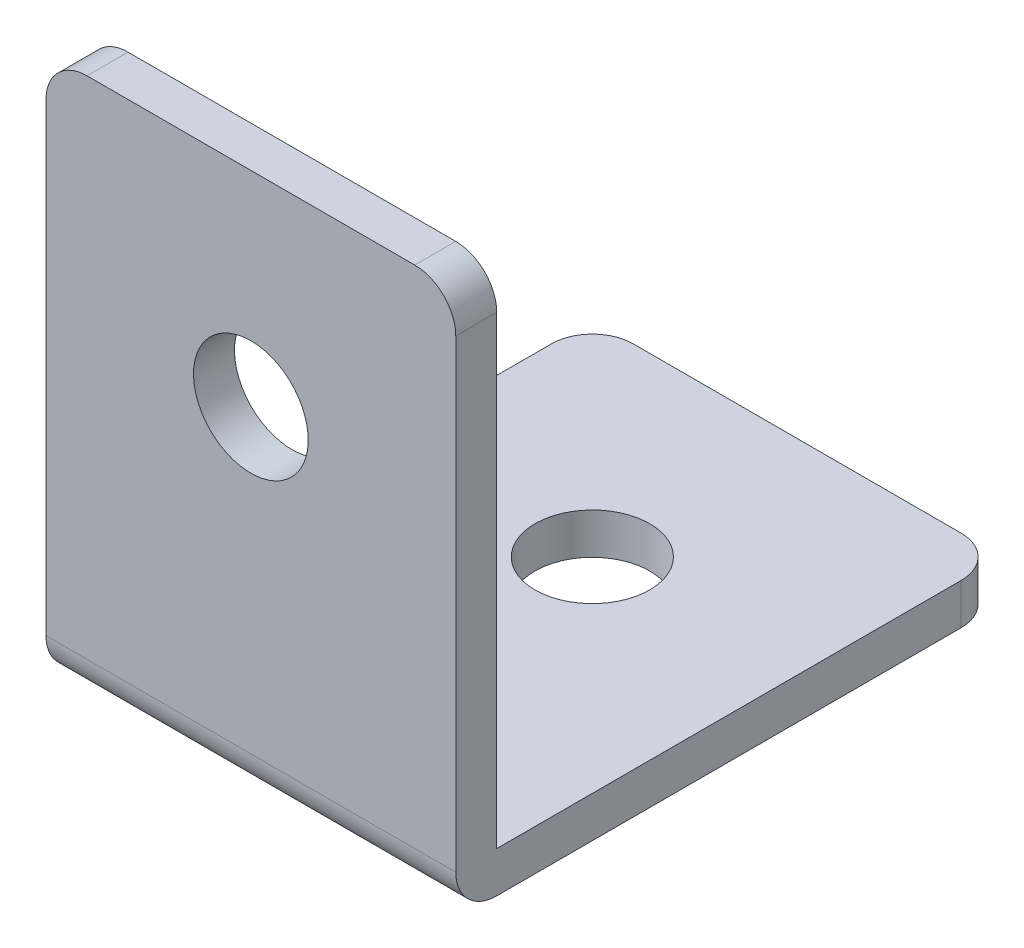
ISO-10303-21;
HEADER;
FILE_DESCRIPTION(('STEP AP214'),'2;1');
FILE_NAME('part.step','',(''),(''),'','','');
FILE_SCHEMA(('AUTOMOTIVE_DESIGN { 1 0 10303 214 1 1 1 1 }'));
ENDSEC;
DATA;
#1=APPLICATION_CONTEXT('core data for automotive mechanical design processes');
#2=APPLICATION_PROTOCOL_DEFINITION('international standard','automotive_design',2000,#1);
#3=PRODUCT_CONTEXT('',#1,'mechanical');
#4=PRODUCT('Part','Part','',(#3));
#5=PRODUCT_RELATED_PRODUCT_CATEGORY('part','',(#4));
#6=PRODUCT_DEFINITION_FORMATION('','',#4);
#7=PRODUCT_DEFINITION_CONTEXT('part definition',#1,'design');
#8=PRODUCT_DEFINITION('design','',#6,#7);
#9=PRODUCT_DEFINITION_SHAPE('','',#8);
#10=(LENGTH_UNIT() NAMED_UNIT(*) SI_UNIT(.MILLI.,.METRE.));
#11=(NAMED_UNIT(*) PLANE_ANGLE_UNIT() SI_UNIT($,.RADIAN.));
#12=(NAMED_UNIT(*) SI_UNIT($,.STERADIAN.) SOLID_ANGLE_UNIT());
#13=UNCERTAINTY_MEASURE_WITH_UNIT(LENGTH_MEASURE(1.E-05),#10,'distance_accuracy_value','');
#14=(GEOMETRIC_REPRESENTATION_CONTEXT(3) GLOBAL_UNCERTAINTY_ASSIGNED_CONTEXT((#13)) GLOBAL_UNIT_ASSIGNED_CONTEXT((#10,
#11,#12)) REPRESENTATION_CONTEXT('',''));
#15=CARTESIAN_POINT('',(0.,0.,0.));
#16=DIRECTION('',(0.,0.,1.));
#17=DIRECTION('',(1.,0.,0.));
#18=AXIS2_PLACEMENT_3D('',#15,#16,#17);
#19=CARTESIAN_POINT('',(15.,0.,-1.5));
#20=DIRECTION('',(0.,1.,0.));
#21=DIRECTION('',(0.,0.,1.));
#22=AXIS2_PLACEMENT_3D('',#19,#20,#21);
#23=PLANE('',#22);
#24=CARTESIAN_POINT('',(7.5,0.,-12.5));
#25=DIRECTION('',(0.,1.,0.));
#26=DIRECTION('',(0.,0.,1.));
#27=AXIS2_PLACEMENT_3D('',#24,#25,#26);
#28=CIRCLE('',#27,2.1);
#29=CARTESIAN_POINT('',(7.5,0.,-10.4));
#30=VERTEX_POINT('',#29);
#31=EDGE_CURVE('E157',#30,#30,#28,.T.);
#32=ORIENTED_EDGE('',*,*,#31,.T.);
#33=EDGE_LOOP('',(#32));
#34=FACE_BOUND('',#33,.T.);
#35=DIRECTION('',(0.,0.,-1.));
#36=VECTOR('',#35,1.);
#37=CARTESIAN_POINT('',(0.,0.,-1.5));
#38=LINE('',#37,#36);
#39=CARTESIAN_POINT('',(0.,0.,-1.5));
#40=VERTEX_POINT('',#39);
#41=CARTESIAN_POINT('',(0.,0.,-18.5));
#42=VERTEX_POINT('',#41);
#43=EDGE_CURVE('E154',#40,#42,#38,.T.);
#44=ORIENTED_EDGE('',*,*,#43,.T.);
#45=CARTESIAN_POINT('',(1.5,0.,-18.5));
#46=DIRECTION('',(0.,1.,0.));
#47=DIRECTION('',(0.,0.,1.));
#48=AXIS2_PLACEMENT_3D('',#45,#46,#47);
#49=CIRCLE('',#48,1.5);
#50=CARTESIAN_POINT('',(1.5,0.,-20.));
#51=VERTEX_POINT('',#50);
#52=EDGE_CURVE('E184',#42,#51,#49,.F.);
#53=ORIENTED_EDGE('',*,*,#52,.T.);
#54=DIRECTION('',(-1.,0.,0.));
#55=VECTOR('',#54,1.);
#56=CARTESIAN_POINT('',(15.,0.,-20.));
#57=LINE('',#56,#55);
#58=CARTESIAN_POINT('',(13.5,0.,-20.));
#59=VERTEX_POINT('',#58);
#60=EDGE_CURVE('E173',#59,#51,#57,.T.);
#61=ORIENTED_EDGE('',*,*,#60,.F.);
#62=CARTESIAN_POINT('',(13.5,0.,-18.5));
#63=DIRECTION('',(0.,1.,0.));
#64=DIRECTION('',(0.,0.,1.));
#65=AXIS2_PLACEMENT_3D('',#62,#63,#64);
#66=CIRCLE('',#65,1.5);
#67=CARTESIAN_POINT('',(15.,0.,-18.5));
#68=VERTEX_POINT('',#67);
#69=EDGE_CURVE('E182',#59,#68,#66,.F.);
#70=ORIENTED_EDGE('',*,*,#69,.T.);
#71=DIRECTION('',(0.,0.,-1.));
#72=VECTOR('',#71,1.);
#73=CARTESIAN_POINT('',(15.,0.,-1.5));
#74=LINE('',#73,#72);
#75=CARTESIAN_POINT('',(15.,0.,-1.5));
#76=VERTEX_POINT('',#75);
#77=EDGE_CURVE('E144',#76,#68,#74,.T.);
#78=ORIENTED_EDGE('',*,*,#77,.F.);
#79=DIRECTION('',(-1.,0.,0.));
#80=VECTOR('',#79,1.);
#81=CARTESIAN_POINT('',(15.,0.,-1.5));
#82=LINE('',#81,#80);
#83=EDGE_CURVE('E153',#76,#40,#82,.T.);
#84=ORIENTED_EDGE('',*,*,#83,.T.);
#85=EDGE_LOOP('',(#44,#53,#61,#70,#78,#84));
#86=FACE_BOUND('',#85,.T.);
#87=ADVANCED_FACE('F33',(#34,#86),#23,.F.);
#88=CARTESIAN_POINT('',(15.,1.5,-20.));
#89=DIRECTION('',(0.,0.,-1.));
#90=DIRECTION('',(-1.,0.,0.));
#91=AXIS2_PLACEMENT_3D('',#88,#89,#90);
#92=PLANE('',#91);
#93=ORIENTED_EDGE('',*,*,#60,.T.);
#94=DIRECTION('',(0.,-1.,0.));
#95=VECTOR('',#94,1.);
#96=CARTESIAN_POINT('',(1.5,1.5,-20.));
#97=LINE('',#96,#95);
#98=CARTESIAN_POINT('',(1.5,1.5,-20.));
#99=VERTEX_POINT('',#98);
#100=EDGE_CURVE('E189',#51,#99,#97,.F.);
#101=ORIENTED_EDGE('',*,*,#100,.T.);
#102=DIRECTION('',(-1.,0.,0.));
#103=VECTOR('',#102,1.);
#104=CARTESIAN_POINT('',(15.,1.5,-20.));
#105=LINE('',#104,#103);
#106=CARTESIAN_POINT('',(13.5,1.5,-20.));
#107=VERTEX_POINT('',#106);
#108=EDGE_CURVE('E137',#107,#99,#105,.T.);
#109=ORIENTED_EDGE('',*,*,#108,.F.);
#110=DIRECTION('',(0.,-1.,0.));
#111=VECTOR('',#110,1.);
#112=CARTESIAN_POINT('',(13.5,1.5,-20.));
#113=LINE('',#112,#111);
#114=EDGE_CURVE('E186',#107,#59,#113,.T.);
#115=ORIENTED_EDGE('',*,*,#114,.T.);
#116=EDGE_LOOP('',(#93,#101,#109,#115));
#117=FACE_BOUND('',#116,.T.);
#118=ADVANCED_FACE('F229',(#117),#92,.T.);
#119=CARTESIAN_POINT('',(15.,1.5,-1.5));
#120=DIRECTION('',(0.,1.,0.));
#121=DIRECTION('',(0.,0.,1.));
#122=AXIS2_PLACEMENT_3D('',#119,#120,#121);
#123=PLANE('',#122);
#124=CARTESIAN_POINT('',(7.5,1.5,-12.5));
#125=DIRECTION('',(0.,1.,0.));
#126=DIRECTION('',(0.,0.,1.));
#127=AXIS2_PLACEMENT_3D('',#124,#125,#126);
#128=CIRCLE('',#127,2.1);
#129=CARTESIAN_POINT('',(7.5,1.5,-10.4));
#130=VERTEX_POINT('',#129);
#131=EDGE_CURVE('E365',#130,#130,#128,.T.);
#132=ORIENTED_EDGE('',*,*,#131,.F.);
#133=EDGE_LOOP('',(#132));
#134=FACE_BOUND('',#133,.T.);
#135=ORIENTED_EDGE('',*,*,#108,.T.);
#136=CARTESIAN_POINT('',(1.5,1.5,-18.5));
#137=DIRECTION('',(0.,1.,0.));
#138=DIRECTION('',(0.,0.,1.));
#139=AXIS2_PLACEMENT_3D('',#136,#137,#138);
#140=CIRCLE('',#139,1.5);
#141=CARTESIAN_POINT('',(0.,1.5,-18.5));
#142=VERTEX_POINT('',#141);
#143=EDGE_CURVE('E193',#99,#142,#140,.T.);
#144=ORIENTED_EDGE('',*,*,#143,.T.);
#145=DIRECTION('',(0.,0.,-1.));
#146=VECTOR('',#145,1.);
#147=CARTESIAN_POINT('',(0.,1.5,-1.5));
#148=LINE('',#147,#146);
#149=CARTESIAN_POINT('',(0.,1.5,-1.5));
#150=VERTEX_POINT('',#149);
#151=EDGE_CURVE('E136',#150,#142,#148,.T.);
#152=ORIENTED_EDGE('',*,*,#151,.F.);
#153=DIRECTION('',(-1.,0.,0.));
#154=VECTOR('',#153,1.);
#155=CARTESIAN_POINT('',(15.,1.5,-1.5));
#156=LINE('',#155,#154);
#157=CARTESIAN_POINT('',(15.,1.5,-1.5));
#158=VERTEX_POINT('',#157);
#159=EDGE_CURVE('E120',#158,#150,#156,.T.);
#160=ORIENTED_EDGE('',*,*,#159,.F.);
#161=DIRECTION('',(0.,0.,-1.));
#162=VECTOR('',#161,1.);
#163=CARTESIAN_POINT('',(15.,1.5,-1.5));
#164=LINE('',#163,#162);
#165=CARTESIAN_POINT('',(15.,1.5,-18.5));
#166=VERTEX_POINT('',#165);
#167=EDGE_CURVE('E128',#158,#166,#164,.T.);
#168=ORIENTED_EDGE('',*,*,#167,.T.);
#169=CARTESIAN_POINT('',(13.5,1.5,-18.5));
#170=DIRECTION('',(0.,1.,0.));
#171=DIRECTION('',(0.,0.,1.));
#172=AXIS2_PLACEMENT_3D('',#169,#170,#171);
#173=CIRCLE('',#172,1.5);
#174=EDGE_CURVE('E191',#166,#107,#173,.T.);
#175=ORIENTED_EDGE('',*,*,#174,.T.);
#176=EDGE_LOOP('',(#135,#144,#152,#160,#168,#175));
#177=FACE_BOUND('',#176,.T.);
#178=ADVANCED_FACE('F133',(#134,#177),#123,.T.);
#179=CARTESIAN_POINT('',(15.,20.,-1.5));
#180=DIRECTION('',(0.,0.,-1.));
#181=DIRECTION('',(0.,1.,0.));
#182=AXIS2_PLACEMENT_3D('',#179,#180,#181);
#183=PLANE('',#182);
#184=CARTESIAN_POINT('',(7.5,12.5,-1.5));
#185=DIRECTION('',(0.,0.,-1.));
#186=DIRECTION('',(0.,1.,0.));
#187=AXIS2_PLACEMENT_3D('',#184,#185,#186);
#188=CIRCLE('',#187,2.09999999999999);
#189=CARTESIAN_POINT('',(7.5,14.6,-1.5));
#190=VERTEX_POINT('',#189);
#191=EDGE_CURVE('E370',#190,#190,#188,.T.);
#192=ORIENTED_EDGE('',*,*,#191,.F.);
#193=EDGE_LOOP('',(#192));
#194=FACE_BOUND('',#193,.T.);
#195=DIRECTION('',(0.,-1.,0.));
#196=VECTOR('',#195,1.);
#197=CARTESIAN_POINT('',(0.,20.,-1.5));
#198=LINE('',#197,#196);
#199=CARTESIAN_POINT('',(0.,18.5,-1.5));
#200=VERTEX_POINT('',#199);
#201=EDGE_CURVE('E159',#200,#150,#198,.T.);
#202=ORIENTED_EDGE('',*,*,#201,.F.);
#203=CARTESIAN_POINT('',(1.5,18.5,-1.5));
#204=DIRECTION('',(0.,0.,-1.));
#205=DIRECTION('',(0.,1.,0.));
#206=AXIS2_PLACEMENT_3D('',#203,#204,#205);
#207=CIRCLE('',#206,1.5);
#208=CARTESIAN_POINT('',(1.5,20.,-1.5));
#209=VERTEX_POINT('',#208);
#210=EDGE_CURVE('E199',#200,#209,#207,.T.);
#211=ORIENTED_EDGE('',*,*,#210,.T.);
#212=DIRECTION('',(-1.,0.,0.));
#213=VECTOR('',#212,1.);
#214=CARTESIAN_POINT('',(15.,20.,-1.5));
#215=LINE('',#214,#213);
#216=CARTESIAN_POINT('',(13.5,20.,-1.5));
#217=VERTEX_POINT('',#216);
#218=EDGE_CURVE('E138',#217,#209,#215,.T.);
#219=ORIENTED_EDGE('',*,*,#218,.F.);
#220=CARTESIAN_POINT('',(13.5,18.5,-1.5));
#221=DIRECTION('',(0.,0.,-1.));
#222=DIRECTION('',(0.,1.,0.));
#223=AXIS2_PLACEMENT_3D('',#220,#221,#222);
#224=CIRCLE('',#223,1.5);
#225=CARTESIAN_POINT('',(15.,18.5,-1.5));
#226=VERTEX_POINT('',#225);
#227=EDGE_CURVE('E123',#217,#226,#224,.T.);
#228=ORIENTED_EDGE('',*,*,#227,.T.);
#229=DIRECTION('',(0.,-1.,0.));
#230=VECTOR('',#229,1.);
#231=CARTESIAN_POINT('',(15.,20.,-1.5));
#232=LINE('',#231,#230);
#233=EDGE_CURVE('E116',#226,#158,#232,.T.);
#234=ORIENTED_EDGE('',*,*,#233,.T.);
#235=ORIENTED_EDGE('',*,*,#159,.T.);
#236=EDGE_LOOP('',(#202,#211,#219,#228,#234,#235));
#237=FACE_BOUND('',#236,.T.);
#238=ADVANCED_FACE('F119',(#194,#237),#183,.T.);
#239=CARTESIAN_POINT('',(15.,20.,0.));
#240=DIRECTION('',(0.,1.,0.));
#241=DIRECTION('',(0.,0.,1.));
#242=AXIS2_PLACEMENT_3D('',#239,#240,#241);
#243=PLANE('',#242);
#244=ORIENTED_EDGE('',*,*,#218,.T.);
#245=DIRECTION('',(0.,0.,-1.));
#246=VECTOR('',#245,1.);
#247=CARTESIAN_POINT('',(1.5,20.,0.));
#248=LINE('',#247,#246);
#249=CARTESIAN_POINT('',(1.5,20.,0.));
#250=VERTEX_POINT('',#249);
#251=EDGE_CURVE('E48',#209,#250,#248,.F.);
#252=ORIENTED_EDGE('',*,*,#251,.T.);
#253=DIRECTION('',(-1.,0.,0.));
#254=VECTOR('',#253,1.);
#255=CARTESIAN_POINT('',(15.,20.,0.));
#256=LINE('',#255,#254);
#257=CARTESIAN_POINT('',(13.5,20.,0.));
#258=VERTEX_POINT('',#257);
#259=EDGE_CURVE('E169',#258,#250,#256,.T.);
#260=ORIENTED_EDGE('',*,*,#259,.F.);
#261=DIRECTION('',(0.,0.,-1.));
#262=VECTOR('',#261,1.);
#263=CARTESIAN_POINT('',(13.5,20.,0.));
#264=LINE('',#263,#262);
#265=EDGE_CURVE('E201',#258,#217,#264,.T.);
#266=ORIENTED_EDGE('',*,*,#265,.T.);
#267=EDGE_LOOP('',(#244,#252,#260,#266));
#268=FACE_BOUND('',#267,.T.);
#269=ADVANCED_FACE('F205',(#268),#243,.T.);
#270=CARTESIAN_POINT('',(15.,20.,0.));
#271=DIRECTION('',(0.,0.,-1.));
#272=DIRECTION('',(0.,1.,0.));
#273=AXIS2_PLACEMENT_3D('',#270,#271,#272);
#274=PLANE('',#273);
#275=CARTESIAN_POINT('',(7.5,12.5,0.));
#276=DIRECTION('',(0.,0.,-1.));
#277=DIRECTION('',(0.,1.,0.));
#278=AXIS2_PLACEMENT_3D('',#275,#276,#277);
#279=CIRCLE('',#278,2.1);
#280=CARTESIAN_POINT('',(7.5,14.6,0.));
#281=VERTEX_POINT('',#280);
#282=EDGE_CURVE('E367',#281,#281,#279,.T.);
#283=ORIENTED_EDGE('',*,*,#282,.T.);
#284=EDGE_LOOP('',(#283));
#285=FACE_BOUND('',#284,.T.);
#286=ORIENTED_EDGE('',*,*,#259,.T.);
#287=CARTESIAN_POINT('',(1.5,18.5,0.));
#288=DIRECTION('',(0.,0.,-1.));
#289=DIRECTION('',(0.,1.,0.));
#290=AXIS2_PLACEMENT_3D('',#287,#288,#289);
#291=CIRCLE('',#290,1.5);
#292=CARTESIAN_POINT('',(0.,18.5,0.));
#293=VERTEX_POINT('',#292);
#294=EDGE_CURVE('E11',#250,#293,#291,.F.);
#295=ORIENTED_EDGE('',*,*,#294,.T.);
#296=DIRECTION('',(0.,-1.,0.));
#297=VECTOR('',#296,1.);
#298=CARTESIAN_POINT('',(0.,20.,0.));
#299=LINE('',#298,#297);
#300=CARTESIAN_POINT('',(0.,1.5,0.));
#301=VERTEX_POINT('',#300);
#302=EDGE_CURVE('E161',#293,#301,#299,.T.);
#303=ORIENTED_EDGE('',*,*,#302,.T.);
#304=DIRECTION('',(-1.,0.,0.));
#305=VECTOR('',#304,1.);
#306=CARTESIAN_POINT('',(15.,1.5,0.));
#307=LINE('',#306,#305);
#308=CARTESIAN_POINT('',(15.,1.5,0.));
#309=VERTEX_POINT('',#308);
#310=EDGE_CURVE('E166',#309,#301,#307,.T.);
#311=ORIENTED_EDGE('',*,*,#310,.F.);
#312=DIRECTION('',(0.,-1.,0.));
#313=VECTOR('',#312,1.);
#314=CARTESIAN_POINT('',(15.,20.,0.));
#315=LINE('',#314,#313);
#316=CARTESIAN_POINT('',(15.,18.5,0.));
#317=VERTEX_POINT('',#316);
#318=EDGE_CURVE('E127',#317,#309,#315,.T.);
#319=ORIENTED_EDGE('',*,*,#318,.F.);
#320=CARTESIAN_POINT('',(13.5,18.5,0.));
#321=DIRECTION('',(0.,0.,-1.));
#322=DIRECTION('',(0.,1.,0.));
#323=AXIS2_PLACEMENT_3D('',#320,#321,#322);
#324=CIRCLE('',#323,1.5);
#325=EDGE_CURVE('E41',#317,#258,#324,.F.);
#326=ORIENTED_EDGE('',*,*,#325,.T.);
#327=EDGE_LOOP('',(#286,#295,#303,#311,#319,#326));
#328=FACE_BOUND('',#327,.T.);
#329=ADVANCED_FACE('F217',(#285,#328),#274,.F.);
#330=CARTESIAN_POINT('',(15.,1.5,-1.5));
#331=DIRECTION('',(-1.,0.,0.));
#332=DIRECTION('',(0.,0.,1.));
#333=AXIS2_PLACEMENT_3D('',#330,#331,#332);
#334=CYLINDRICAL_SURFACE('',#333,1.5);
#335=CARTESIAN_POINT('',(0.,1.5,-1.5));
#336=DIRECTION('',(1.,0.,0.));
#337=DIRECTION('',(0.,0.,-1.));
#338=AXIS2_PLACEMENT_3D('',#335,#336,#337);
#339=CIRCLE('',#338,1.5);
#340=EDGE_CURVE('E146',#301,#40,#339,.T.);
#341=ORIENTED_EDGE('',*,*,#340,.T.);
#342=ORIENTED_EDGE('',*,*,#83,.F.);
#343=CARTESIAN_POINT('',(15.,1.5,-1.5));
#344=DIRECTION('',(1.,0.,0.));
#345=DIRECTION('',(0.,0.,-1.));
#346=AXIS2_PLACEMENT_3D('',#343,#344,#345);
#347=CIRCLE('',#346,1.5);
#348=EDGE_CURVE('E151',#309,#76,#347,.T.);
#349=ORIENTED_EDGE('',*,*,#348,.F.);
#350=ORIENTED_EDGE('',*,*,#310,.T.);
#351=EDGE_LOOP('',(#341,#342,#349,#350));
#352=FACE_BOUND('',#351,.T.);
#353=ADVANCED_FACE('F220',(#352),#334,.T.);
#354=CARTESIAN_POINT('',(15.,1.5,-1.5));
#355=DIRECTION('',(1.,0.,0.));
#356=DIRECTION('',(0.,0.,-1.));
#357=AXIS2_PLACEMENT_3D('',#354,#355,#356);
#358=PLANE('',#357);
#359=ORIENTED_EDGE('',*,*,#77,.T.);
#360=DIRECTION('',(0.,-1.,0.));
#361=VECTOR('',#360,1.);
#362=CARTESIAN_POINT('',(15.,1.5,-18.5));
#363=LINE('',#362,#361);
#364=EDGE_CURVE('E143',#68,#166,#363,.F.);
#365=ORIENTED_EDGE('',*,*,#364,.T.);
#366=ORIENTED_EDGE('',*,*,#167,.F.);
#367=ORIENTED_EDGE('',*,*,#233,.F.);
#368=DIRECTION('',(0.,0.,-1.));
#369=VECTOR('',#368,1.);
#370=CARTESIAN_POINT('',(15.,18.5,-1.5));
#371=LINE('',#370,#369);
#372=EDGE_CURVE('E195',#226,#317,#371,.F.);
#373=ORIENTED_EDGE('',*,*,#372,.T.);
#374=ORIENTED_EDGE('',*,*,#318,.T.);
#375=ORIENTED_EDGE('',*,*,#348,.T.);
#376=EDGE_LOOP('',(#359,#365,#366,#367,#373,#374,#375));
#377=FACE_BOUND('',#376,.T.);
#378=ADVANCED_FACE('F141',(#377),#358,.T.);
#379=CARTESIAN_POINT('',(0.,1.5,-1.5));
#380=DIRECTION('',(1.,0.,0.));
#381=DIRECTION('',(0.,0.,-1.));
#382=AXIS2_PLACEMENT_3D('',#379,#380,#381);
#383=PLANE('',#382);
#384=ORIENTED_EDGE('',*,*,#151,.T.);
#385=DIRECTION('',(0.,-1.,0.));
#386=VECTOR('',#385,1.);
#387=CARTESIAN_POINT('',(0.,0.,-18.5));
#388=LINE('',#387,#386);
#389=EDGE_CURVE('E179',#142,#42,#388,.T.);
#390=ORIENTED_EDGE('',*,*,#389,.T.);
#391=ORIENTED_EDGE('',*,*,#43,.F.);
#392=ORIENTED_EDGE('',*,*,#340,.F.);
#393=ORIENTED_EDGE('',*,*,#302,.F.);
#394=DIRECTION('',(0.,0.,-1.));
#395=VECTOR('',#394,1.);
#396=CARTESIAN_POINT('',(0.,18.5,-1.5));
#397=LINE('',#396,#395);
#398=EDGE_CURVE('E176',#293,#200,#397,.T.);
#399=ORIENTED_EDGE('',*,*,#398,.T.);
#400=ORIENTED_EDGE('',*,*,#201,.T.);
#401=EDGE_LOOP('',(#384,#390,#391,#392,#393,#399,#400));
#402=FACE_BOUND('',#401,.T.);
#403=ADVANCED_FACE('F213',(#402),#383,.F.);
#404=CARTESIAN_POINT('',(7.5,1.5,-12.5));
#405=DIRECTION('',(0.,1.,0.));
#406=DIRECTION('',(0.,0.,1.));
#407=AXIS2_PLACEMENT_3D('',#404,#405,#406);
#408=CYLINDRICAL_SURFACE('',#407,2.1);
#409=ORIENTED_EDGE('',*,*,#31,.F.);
#410=EDGE_LOOP('',(#409));
#411=FACE_BOUND('',#410,.T.);
#412=ORIENTED_EDGE('',*,*,#131,.T.);
#413=EDGE_LOOP('',(#412));
#414=FACE_BOUND('',#413,.T.);
#415=ADVANCED_FACE('F283',(#411,#414),#408,.F.);
#416=CARTESIAN_POINT('',(7.5,12.5,-1.5));
#417=DIRECTION('',(0.,0.,-1.));
#418=DIRECTION('',(0.,1.,0.));
#419=AXIS2_PLACEMENT_3D('',#416,#417,#418);
#420=CYLINDRICAL_SURFACE('',#419,2.09999999999999);
#421=ORIENTED_EDGE('',*,*,#282,.F.);
#422=EDGE_LOOP('',(#421));
#423=FACE_BOUND('',#422,.T.);
#424=ORIENTED_EDGE('',*,*,#191,.T.);
#425=EDGE_LOOP('',(#424));
#426=FACE_BOUND('',#425,.T.);
#427=ADVANCED_FACE('F244',(#423,#426),#420,.F.);
#428=CARTESIAN_POINT('',(1.5,1.5,-18.5));
#429=DIRECTION('',(0.,1.,0.));
#430=DIRECTION('',(0.,0.,1.));
#431=AXIS2_PLACEMENT_3D('',#428,#429,#430);
#432=CYLINDRICAL_SURFACE('',#431,1.5);
#433=ORIENTED_EDGE('',*,*,#143,.F.);
#434=ORIENTED_EDGE('',*,*,#100,.F.);
#435=ORIENTED_EDGE('',*,*,#52,.F.);
#436=ORIENTED_EDGE('',*,*,#389,.F.);
#437=EDGE_LOOP('',(#433,#434,#435,#436));
#438=FACE_BOUND('',#437,.T.);
#439=ADVANCED_FACE('F241',(#438),#432,.T.);
#440=CARTESIAN_POINT('',(13.5,1.5,-18.5));
#441=DIRECTION('',(0.,-1.,0.));
#442=DIRECTION('',(0.,0.,-1.));
#443=AXIS2_PLACEMENT_3D('',#440,#441,#442);
#444=CYLINDRICAL_SURFACE('',#443,1.5);
#445=ORIENTED_EDGE('',*,*,#174,.F.);
#446=ORIENTED_EDGE('',*,*,#364,.F.);
#447=ORIENTED_EDGE('',*,*,#69,.F.);
#448=ORIENTED_EDGE('',*,*,#114,.F.);
#449=EDGE_LOOP('',(#445,#446,#447,#448));
#450=FACE_BOUND('',#449,.T.);
#451=ADVANCED_FACE('F227',(#450),#444,.T.);
#452=CARTESIAN_POINT('',(1.5,18.5,-1.5));
#453=DIRECTION('',(0.,0.,1.));
#454=DIRECTION('',(1.,0.,0.));
#455=AXIS2_PLACEMENT_3D('',#452,#453,#454);
#456=CYLINDRICAL_SURFACE('',#455,1.5);
#457=ORIENTED_EDGE('',*,*,#294,.F.);
#458=ORIENTED_EDGE('',*,*,#251,.F.);
#459=ORIENTED_EDGE('',*,*,#210,.F.);
#460=ORIENTED_EDGE('',*,*,#398,.F.);
#461=EDGE_LOOP('',(#457,#458,#459,#460));
#462=FACE_BOUND('',#461,.T.);
#463=ADVANCED_FACE('F210',(#462),#456,.T.);
#464=CARTESIAN_POINT('',(13.5,18.5,0.));
#465=DIRECTION('',(0.,0.,-1.));
#466=DIRECTION('',(-1.,0.,0.));
#467=AXIS2_PLACEMENT_3D('',#464,#465,#466);
#468=CYLINDRICAL_SURFACE('',#467,1.5);
#469=ORIENTED_EDGE('',*,*,#325,.F.);
#470=ORIENTED_EDGE('',*,*,#372,.F.);
#471=ORIENTED_EDGE('',*,*,#227,.F.);
#472=ORIENTED_EDGE('',*,*,#265,.F.);
#473=EDGE_LOOP('',(#469,#470,#471,#472));
#474=FACE_BOUND('',#473,.T.);
#475=ADVANCED_FACE('F35',(#474),#468,.T.);
#476=CLOSED_SHELL('',(#87,#118,#178,#238,#269,#329,#353,#378,#403,#415,#427,#439,#451,#463,#475));
#477=MANIFOLD_SOLID_BREP('B2',#476);
#478=ADVANCED_BREP_SHAPE_REPRESENTATION('',(#18,#477),#14);
#479=SHAPE_DEFINITION_REPRESENTATION(#9,#478);
ENDSEC;
END-ISO-10303-21;
